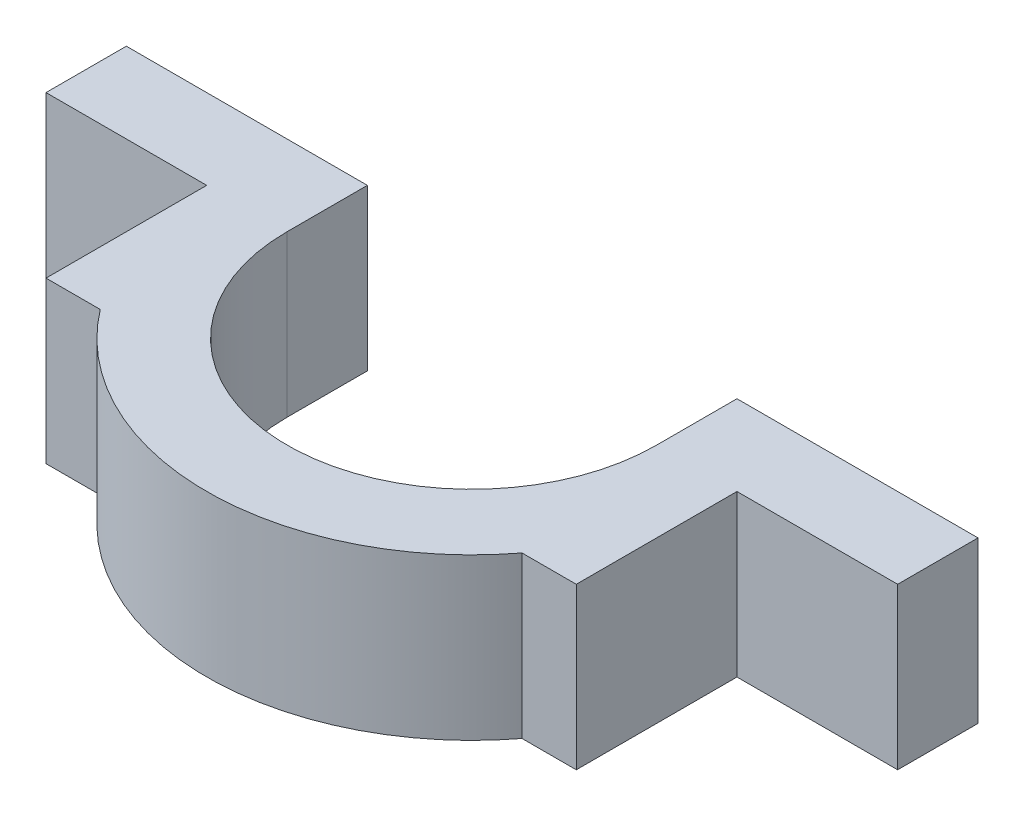
ISO-10303-21;
HEADER;
FILE_DESCRIPTION(('STEP AP214'),'2;1');
FILE_NAME('part.step','',(''),(''),'','','');
FILE_SCHEMA(('AUTOMOTIVE_DESIGN { 1 0 10303 214 1 1 1 1 }'));
ENDSEC;
DATA;
#1=APPLICATION_CONTEXT('core data for automotive mechanical design processes');
#2=APPLICATION_PROTOCOL_DEFINITION('international standard','automotive_design',2000,#1);
#3=PRODUCT_CONTEXT('',#1,'mechanical');
#4=PRODUCT('Part','Part','',(#3));
#5=PRODUCT_RELATED_PRODUCT_CATEGORY('part','',(#4));
#6=PRODUCT_DEFINITION_FORMATION('','',#4);
#7=PRODUCT_DEFINITION_CONTEXT('part definition',#1,'design');
#8=PRODUCT_DEFINITION('design','',#6,#7);
#9=PRODUCT_DEFINITION_SHAPE('','',#8);
#10=(LENGTH_UNIT() NAMED_UNIT(*) SI_UNIT(.MILLI.,.METRE.));
#11=(NAMED_UNIT(*) PLANE_ANGLE_UNIT() SI_UNIT($,.RADIAN.));
#12=(NAMED_UNIT(*) SI_UNIT($,.STERADIAN.) SOLID_ANGLE_UNIT());
#13=UNCERTAINTY_MEASURE_WITH_UNIT(LENGTH_MEASURE(1.E-05),#10,'distance_accuracy_value','');
#14=(GEOMETRIC_REPRESENTATION_CONTEXT(3) GLOBAL_UNCERTAINTY_ASSIGNED_CONTEXT((#13)) GLOBAL_UNIT_ASSIGNED_CONTEXT((#10,
#11,#12)) REPRESENTATION_CONTEXT('',''));
#15=CARTESIAN_POINT('',(0.,0.,0.));
#16=DIRECTION('',(0.,0.,1.));
#17=DIRECTION('',(1.,0.,0.));
#18=AXIS2_PLACEMENT_3D('',#15,#16,#17);
#19=CARTESIAN_POINT('',(0.,10.,0.));
#20=DIRECTION('',(0.,-1.,0.));
#21=DIRECTION('',(0.,0.,-1.));
#22=AXIS2_PLACEMENT_3D('',#19,#20,#21);
#23=CYLINDRICAL_SURFACE('',#22,16.5);
#24=CARTESIAN_POINT('',(0.,0.,0.));
#25=DIRECTION('',(0.,1.,0.));
#26=DIRECTION('',(0.,0.,1.));
#27=AXIS2_PLACEMENT_3D('',#24,#25,#26);
#28=CIRCLE('',#27,16.5);
#29=CARTESIAN_POINT('',(-13.1244047484067,0.,10.));
#30=VERTEX_POINT('',#29);
#31=CARTESIAN_POINT('',(13.1244047484067,0.,10.));
#32=VERTEX_POINT('',#31);
#33=EDGE_CURVE('E180',#30,#32,#28,.T.);
#34=ORIENTED_EDGE('',*,*,#33,.T.);
#35=DIRECTION('',(0.,-1.,0.));
#36=VECTOR('',#35,1.);
#37=CARTESIAN_POINT('',(13.1244047484067,10.,10.));
#38=LINE('',#37,#36);
#39=CARTESIAN_POINT('',(13.1244047484067,10.,10.));
#40=VERTEX_POINT('',#39);
#41=EDGE_CURVE('E11',#40,#32,#38,.T.);
#42=ORIENTED_EDGE('',*,*,#41,.F.);
#43=CARTESIAN_POINT('',(0.,10.,0.));
#44=DIRECTION('',(0.,1.,0.));
#45=DIRECTION('',(0.,0.,1.));
#46=AXIS2_PLACEMENT_3D('',#43,#44,#45);
#47=CIRCLE('',#46,16.5);
#48=CARTESIAN_POINT('',(-13.1244047484067,10.,10.));
#49=VERTEX_POINT('',#48);
#50=EDGE_CURVE('E220',#49,#40,#47,.T.);
#51=ORIENTED_EDGE('',*,*,#50,.F.);
#52=DIRECTION('',(0.,-1.,0.));
#53=VECTOR('',#52,1.);
#54=CARTESIAN_POINT('',(-13.1244047484067,10.,10.));
#55=LINE('',#54,#53);
#56=EDGE_CURVE('E176',#49,#30,#55,.T.);
#57=ORIENTED_EDGE('',*,*,#56,.T.);
#58=EDGE_LOOP('',(#34,#42,#51,#57));
#59=FACE_BOUND('',#58,.T.);
#60=ADVANCED_FACE('F43',(#59),#23,.T.);
#61=CARTESIAN_POINT('',(13.1244047484067,10.,10.));
#62=DIRECTION('',(0.,0.,-1.));
#63=DIRECTION('',(-1.,0.,0.));
#64=AXIS2_PLACEMENT_3D('',#61,#62,#63);
#65=PLANE('',#64);
#66=DIRECTION('',(1.,0.,0.));
#67=VECTOR('',#66,1.);
#68=CARTESIAN_POINT('',(13.1244047484067,0.,10.));
#69=LINE('',#68,#67);
#70=CARTESIAN_POINT('',(16.5,0.,10.));
#71=VERTEX_POINT('',#70);
#72=EDGE_CURVE('E184',#32,#71,#69,.T.);
#73=ORIENTED_EDGE('',*,*,#72,.T.);
#74=DIRECTION('',(0.,-1.,0.));
#75=VECTOR('',#74,1.);
#76=CARTESIAN_POINT('',(16.5,10.,10.));
#77=LINE('',#76,#75);
#78=CARTESIAN_POINT('',(16.5,10.,10.));
#79=VERTEX_POINT('',#78);
#80=EDGE_CURVE('E52',#79,#71,#77,.T.);
#81=ORIENTED_EDGE('',*,*,#80,.F.);
#82=DIRECTION('',(1.,0.,0.));
#83=VECTOR('',#82,1.);
#84=CARTESIAN_POINT('',(13.1244047484067,10.,10.));
#85=LINE('',#84,#83);
#86=EDGE_CURVE('E121',#40,#79,#85,.T.);
#87=ORIENTED_EDGE('',*,*,#86,.F.);
#88=ORIENTED_EDGE('',*,*,#41,.T.);
#89=EDGE_LOOP('',(#73,#81,#87,#88));
#90=FACE_BOUND('',#89,.T.);
#91=ADVANCED_FACE('F328',(#90),#65,.F.);
#92=CARTESIAN_POINT('',(16.5,10.,10.));
#93=DIRECTION('',(-1.,0.,0.));
#94=DIRECTION('',(0.,0.,1.));
#95=AXIS2_PLACEMENT_3D('',#92,#93,#94);
#96=PLANE('',#95);
#97=DIRECTION('',(0.,0.,-1.));
#98=VECTOR('',#97,1.);
#99=CARTESIAN_POINT('',(16.5,0.,10.));
#100=LINE('',#99,#98);
#101=CARTESIAN_POINT('',(16.5,0.,0.));
#102=VERTEX_POINT('',#101);
#103=EDGE_CURVE('E187',#71,#102,#100,.T.);
#104=ORIENTED_EDGE('',*,*,#103,.T.);
#105=DIRECTION('',(0.,-1.,0.));
#106=VECTOR('',#105,1.);
#107=CARTESIAN_POINT('',(16.5,10.,0.));
#108=LINE('',#107,#106);
#109=CARTESIAN_POINT('',(16.5,10.,0.));
#110=VERTEX_POINT('',#109);
#111=EDGE_CURVE('E255',#110,#102,#108,.T.);
#112=ORIENTED_EDGE('',*,*,#111,.F.);
#113=DIRECTION('',(0.,0.,-1.));
#114=VECTOR('',#113,1.);
#115=CARTESIAN_POINT('',(16.5,10.,10.));
#116=LINE('',#115,#114);
#117=EDGE_CURVE('E265',#79,#110,#116,.T.);
#118=ORIENTED_EDGE('',*,*,#117,.F.);
#119=ORIENTED_EDGE('',*,*,#80,.T.);
#120=EDGE_LOOP('',(#104,#112,#118,#119));
#121=FACE_BOUND('',#120,.T.);
#122=ADVANCED_FACE('F263',(#121),#96,.F.);
#123=CARTESIAN_POINT('',(16.5,10.,0.));
#124=DIRECTION('',(0.,0.,-1.));
#125=DIRECTION('',(-1.,0.,0.));
#126=AXIS2_PLACEMENT_3D('',#123,#124,#125);
#127=PLANE('',#126);
#128=DIRECTION('',(1.,0.,0.));
#129=VECTOR('',#128,1.);
#130=CARTESIAN_POINT('',(16.5,0.,0.));
#131=LINE('',#130,#129);
#132=CARTESIAN_POINT('',(26.5,0.,0.));
#133=VERTEX_POINT('',#132);
#134=EDGE_CURVE('E190',#102,#133,#131,.T.);
#135=ORIENTED_EDGE('',*,*,#134,.T.);
#136=DIRECTION('',(0.,-1.,0.));
#137=VECTOR('',#136,1.);
#138=CARTESIAN_POINT('',(26.5,10.,0.));
#139=LINE('',#138,#137);
#140=CARTESIAN_POINT('',(26.5,10.,0.));
#141=VERTEX_POINT('',#140);
#142=EDGE_CURVE('E251',#141,#133,#139,.T.);
#143=ORIENTED_EDGE('',*,*,#142,.F.);
#144=DIRECTION('',(1.,0.,0.));
#145=VECTOR('',#144,1.);
#146=CARTESIAN_POINT('',(16.5,10.,0.));
#147=LINE('',#146,#145);
#148=EDGE_CURVE('E284',#110,#141,#147,.T.);
#149=ORIENTED_EDGE('',*,*,#148,.F.);
#150=ORIENTED_EDGE('',*,*,#111,.T.);
#151=EDGE_LOOP('',(#135,#143,#149,#150));
#152=FACE_BOUND('',#151,.T.);
#153=ADVANCED_FACE('F274',(#152),#127,.F.);
#154=CARTESIAN_POINT('',(26.5,10.,0.));
#155=DIRECTION('',(-1.,0.,0.));
#156=DIRECTION('',(0.,0.,1.));
#157=AXIS2_PLACEMENT_3D('',#154,#155,#156);
#158=PLANE('',#157);
#159=DIRECTION('',(0.,0.,-1.));
#160=VECTOR('',#159,1.);
#161=CARTESIAN_POINT('',(26.5,0.,0.));
#162=LINE('',#161,#160);
#163=CARTESIAN_POINT('',(26.5,0.,-5.));
#164=VERTEX_POINT('',#163);
#165=EDGE_CURVE('E193',#133,#164,#162,.T.);
#166=ORIENTED_EDGE('',*,*,#165,.T.);
#167=DIRECTION('',(0.,-1.,0.));
#168=VECTOR('',#167,1.);
#169=CARTESIAN_POINT('',(26.5,10.,-5.));
#170=LINE('',#169,#168);
#171=CARTESIAN_POINT('',(26.5,10.,-5.));
#172=VERTEX_POINT('',#171);
#173=EDGE_CURVE('E247',#172,#164,#170,.T.);
#174=ORIENTED_EDGE('',*,*,#173,.F.);
#175=DIRECTION('',(0.,0.,-1.));
#176=VECTOR('',#175,1.);
#177=CARTESIAN_POINT('',(26.5,10.,0.));
#178=LINE('',#177,#176);
#179=EDGE_CURVE('E280',#141,#172,#178,.T.);
#180=ORIENTED_EDGE('',*,*,#179,.F.);
#181=ORIENTED_EDGE('',*,*,#142,.T.);
#182=EDGE_LOOP('',(#166,#174,#180,#181));
#183=FACE_BOUND('',#182,.T.);
#184=ADVANCED_FACE('F278',(#183),#158,.F.);
#185=CARTESIAN_POINT('',(26.5,10.,-5.));
#186=DIRECTION('',(0.,0.,1.));
#187=DIRECTION('',(1.,0.,0.));
#188=AXIS2_PLACEMENT_3D('',#185,#186,#187);
#189=PLANE('',#188);
#190=DIRECTION('',(-1.,0.,0.));
#191=VECTOR('',#190,1.);
#192=CARTESIAN_POINT('',(26.5,0.,-5.));
#193=LINE('',#192,#191);
#194=CARTESIAN_POINT('',(11.5,0.,-5.));
#195=VERTEX_POINT('',#194);
#196=EDGE_CURVE('E196',#164,#195,#193,.T.);
#197=ORIENTED_EDGE('',*,*,#196,.T.);
#198=DIRECTION('',(0.,-1.,0.));
#199=VECTOR('',#198,1.);
#200=CARTESIAN_POINT('',(11.5,10.,-5.));
#201=LINE('',#200,#199);
#202=CARTESIAN_POINT('',(11.5,10.,-5.));
#203=VERTEX_POINT('',#202);
#204=EDGE_CURVE('E243',#203,#195,#201,.T.);
#205=ORIENTED_EDGE('',*,*,#204,.F.);
#206=DIRECTION('',(-1.,0.,0.));
#207=VECTOR('',#206,1.);
#208=CARTESIAN_POINT('',(26.5,10.,-5.));
#209=LINE('',#208,#207);
#210=EDGE_CURVE('E283',#172,#203,#209,.T.);
#211=ORIENTED_EDGE('',*,*,#210,.F.);
#212=ORIENTED_EDGE('',*,*,#173,.T.);
#213=EDGE_LOOP('',(#197,#205,#211,#212));
#214=FACE_BOUND('',#213,.T.);
#215=ADVANCED_FACE('F341',(#214),#189,.F.);
#216=CARTESIAN_POINT('',(11.5,10.,0.));
#217=DIRECTION('',(1.,0.,0.));
#218=DIRECTION('',(0.,0.,-1.));
#219=AXIS2_PLACEMENT_3D('',#216,#217,#218);
#220=PLANE('',#219);
#221=DIRECTION('',(0.,0.,1.));
#222=VECTOR('',#221,1.);
#223=CARTESIAN_POINT('',(11.5,0.,0.));
#224=LINE('',#223,#222);
#225=CARTESIAN_POINT('',(11.5,0.,0.));
#226=VERTEX_POINT('',#225);
#227=EDGE_CURVE('E199',#195,#226,#224,.T.);
#228=ORIENTED_EDGE('',*,*,#227,.T.);
#229=DIRECTION('',(0.,-1.,0.));
#230=VECTOR('',#229,1.);
#231=CARTESIAN_POINT('',(11.5,10.,0.));
#232=LINE('',#231,#230);
#233=CARTESIAN_POINT('',(11.5,10.,0.));
#234=VERTEX_POINT('',#233);
#235=EDGE_CURVE('E239',#234,#226,#232,.T.);
#236=ORIENTED_EDGE('',*,*,#235,.F.);
#237=DIRECTION('',(0.,0.,1.));
#238=VECTOR('',#237,1.);
#239=CARTESIAN_POINT('',(11.5,10.,0.));
#240=LINE('',#239,#238);
#241=EDGE_CURVE('E288',#203,#234,#240,.T.);
#242=ORIENTED_EDGE('',*,*,#241,.F.);
#243=ORIENTED_EDGE('',*,*,#204,.T.);
#244=EDGE_LOOP('',(#228,#236,#242,#243));
#245=FACE_BOUND('',#244,.T.);
#246=ADVANCED_FACE('F344',(#245),#220,.F.);
#247=CARTESIAN_POINT('',(0.,10.,0.));
#248=DIRECTION('',(0.,-1.,0.));
#249=DIRECTION('',(0.,0.,-1.));
#250=AXIS2_PLACEMENT_3D('',#247,#248,#249);
#251=CYLINDRICAL_SURFACE('',#250,11.5);
#252=CARTESIAN_POINT('',(0.,0.,0.));
#253=DIRECTION('',(0.,-1.,0.));
#254=DIRECTION('',(0.,0.,1.));
#255=AXIS2_PLACEMENT_3D('',#252,#253,#254);
#256=CIRCLE('',#255,11.5);
#257=CARTESIAN_POINT('',(-11.5,0.,0.));
#258=VERTEX_POINT('',#257);
#259=EDGE_CURVE('E202',#226,#258,#256,.T.);
#260=ORIENTED_EDGE('',*,*,#259,.T.);
#261=DIRECTION('',(0.,-1.,0.));
#262=VECTOR('',#261,1.);
#263=CARTESIAN_POINT('',(-11.5,10.,0.));
#264=LINE('',#263,#262);
#265=CARTESIAN_POINT('',(-11.5,10.,0.));
#266=VERTEX_POINT('',#265);
#267=EDGE_CURVE('E235',#266,#258,#264,.T.);
#268=ORIENTED_EDGE('',*,*,#267,.F.);
#269=CARTESIAN_POINT('',(0.,10.,0.));
#270=DIRECTION('',(0.,-1.,0.));
#271=DIRECTION('',(0.,0.,1.));
#272=AXIS2_PLACEMENT_3D('',#269,#270,#271);
#273=CIRCLE('',#272,11.5);
#274=EDGE_CURVE('E295',#234,#266,#273,.T.);
#275=ORIENTED_EDGE('',*,*,#274,.F.);
#276=ORIENTED_EDGE('',*,*,#235,.T.);
#277=EDGE_LOOP('',(#260,#268,#275,#276));
#278=FACE_BOUND('',#277,.T.);
#279=ADVANCED_FACE('F348',(#278),#251,.F.);
#280=CARTESIAN_POINT('',(-11.5,10.,0.));
#281=DIRECTION('',(-1.,0.,0.));
#282=DIRECTION('',(0.,0.,1.));
#283=AXIS2_PLACEMENT_3D('',#280,#281,#282);
#284=PLANE('',#283);
#285=DIRECTION('',(0.,0.,-1.));
#286=VECTOR('',#285,1.);
#287=CARTESIAN_POINT('',(-11.5,0.,0.));
#288=LINE('',#287,#286);
#289=CARTESIAN_POINT('',(-11.5,0.,-5.));
#290=VERTEX_POINT('',#289);
#291=EDGE_CURVE('E205',#258,#290,#288,.T.);
#292=ORIENTED_EDGE('',*,*,#291,.T.);
#293=DIRECTION('',(0.,-1.,0.));
#294=VECTOR('',#293,1.);
#295=CARTESIAN_POINT('',(-11.5,10.,-5.));
#296=LINE('',#295,#294);
#297=CARTESIAN_POINT('',(-11.5,10.,-5.));
#298=VERTEX_POINT('',#297);
#299=EDGE_CURVE('E231',#298,#290,#296,.T.);
#300=ORIENTED_EDGE('',*,*,#299,.F.);
#301=DIRECTION('',(0.,0.,-1.));
#302=VECTOR('',#301,1.);
#303=CARTESIAN_POINT('',(-11.5,10.,0.));
#304=LINE('',#303,#302);
#305=EDGE_CURVE('E298',#266,#298,#304,.T.);
#306=ORIENTED_EDGE('',*,*,#305,.F.);
#307=ORIENTED_EDGE('',*,*,#267,.T.);
#308=EDGE_LOOP('',(#292,#300,#306,#307));
#309=FACE_BOUND('',#308,.T.);
#310=ADVANCED_FACE('F352',(#309),#284,.F.);
#311=CARTESIAN_POINT('',(-11.5,10.,-5.));
#312=DIRECTION('',(0.,0.,1.));
#313=DIRECTION('',(1.,0.,0.));
#314=AXIS2_PLACEMENT_3D('',#311,#312,#313);
#315=PLANE('',#314);
#316=DIRECTION('',(-1.,0.,0.));
#317=VECTOR('',#316,1.);
#318=CARTESIAN_POINT('',(-11.5,0.,-5.));
#319=LINE('',#318,#317);
#320=CARTESIAN_POINT('',(-26.5,0.,-4.99999999999999));
#321=VERTEX_POINT('',#320);
#322=EDGE_CURVE('E208',#290,#321,#319,.T.);
#323=ORIENTED_EDGE('',*,*,#322,.T.);
#324=DIRECTION('',(0.,-1.,0.));
#325=VECTOR('',#324,1.);
#326=CARTESIAN_POINT('',(-26.5,10.,-4.99999999999999));
#327=LINE('',#326,#325);
#328=CARTESIAN_POINT('',(-26.5,10.,-4.99999999999999));
#329=VERTEX_POINT('',#328);
#330=EDGE_CURVE('E227',#329,#321,#327,.T.);
#331=ORIENTED_EDGE('',*,*,#330,.F.);
#332=DIRECTION('',(-1.,0.,0.));
#333=VECTOR('',#332,1.);
#334=CARTESIAN_POINT('',(-11.5,10.,-5.));
#335=LINE('',#334,#333);
#336=EDGE_CURVE('E301',#298,#329,#335,.T.);
#337=ORIENTED_EDGE('',*,*,#336,.F.);
#338=ORIENTED_EDGE('',*,*,#299,.T.);
#339=EDGE_LOOP('',(#323,#331,#337,#338));
#340=FACE_BOUND('',#339,.T.);
#341=ADVANCED_FACE('F309',(#340),#315,.F.);
#342=CARTESIAN_POINT('',(-26.5,10.,-4.99999999999999));
#343=DIRECTION('',(1.,0.,0.));
#344=DIRECTION('',(0.,0.,-1.));
#345=AXIS2_PLACEMENT_3D('',#342,#343,#344);
#346=PLANE('',#345);
#347=DIRECTION('',(0.,0.,1.));
#348=VECTOR('',#347,1.);
#349=CARTESIAN_POINT('',(-26.5,0.,-4.99999999999999));
#350=LINE('',#349,#348);
#351=CARTESIAN_POINT('',(-26.5,0.,0.));
#352=VERTEX_POINT('',#351);
#353=EDGE_CURVE('E211',#321,#352,#350,.T.);
#354=ORIENTED_EDGE('',*,*,#353,.T.);
#355=DIRECTION('',(0.,-1.,0.));
#356=VECTOR('',#355,1.);
#357=CARTESIAN_POINT('',(-26.5,10.,0.));
#358=LINE('',#357,#356);
#359=CARTESIAN_POINT('',(-26.5,10.,0.));
#360=VERTEX_POINT('',#359);
#361=EDGE_CURVE('E169',#360,#352,#358,.T.);
#362=ORIENTED_EDGE('',*,*,#361,.F.);
#363=DIRECTION('',(0.,0.,1.));
#364=VECTOR('',#363,1.);
#365=CARTESIAN_POINT('',(-26.5,10.,-4.99999999999999));
#366=LINE('',#365,#364);
#367=EDGE_CURVE('E158',#329,#360,#366,.T.);
#368=ORIENTED_EDGE('',*,*,#367,.F.);
#369=ORIENTED_EDGE('',*,*,#330,.T.);
#370=EDGE_LOOP('',(#354,#362,#368,#369));
#371=FACE_BOUND('',#370,.T.);
#372=ADVANCED_FACE('F313',(#371),#346,.F.);
#373=CARTESIAN_POINT('',(-26.5,10.,0.));
#374=DIRECTION('',(0.,0.,-1.));
#375=DIRECTION('',(-1.,0.,0.));
#376=AXIS2_PLACEMENT_3D('',#373,#374,#375);
#377=PLANE('',#376);
#378=DIRECTION('',(1.,0.,0.));
#379=VECTOR('',#378,1.);
#380=CARTESIAN_POINT('',(-26.5,0.,0.));
#381=LINE('',#380,#379);
#382=CARTESIAN_POINT('',(-16.5,0.,0.));
#383=VERTEX_POINT('',#382);
#384=EDGE_CURVE('E167',#352,#383,#381,.T.);
#385=ORIENTED_EDGE('',*,*,#384,.T.);
#386=DIRECTION('',(0.,-1.,0.));
#387=VECTOR('',#386,1.);
#388=CARTESIAN_POINT('',(-16.5,10.,0.));
#389=LINE('',#388,#387);
#390=CARTESIAN_POINT('',(-16.5,10.,0.));
#391=VERTEX_POINT('',#390);
#392=EDGE_CURVE('E164',#391,#383,#389,.T.);
#393=ORIENTED_EDGE('',*,*,#392,.F.);
#394=DIRECTION('',(1.,0.,0.));
#395=VECTOR('',#394,1.);
#396=CARTESIAN_POINT('',(-26.5,10.,0.));
#397=LINE('',#396,#395);
#398=EDGE_CURVE('E152',#360,#391,#397,.T.);
#399=ORIENTED_EDGE('',*,*,#398,.F.);
#400=ORIENTED_EDGE('',*,*,#361,.T.);
#401=EDGE_LOOP('',(#385,#393,#399,#400));
#402=FACE_BOUND('',#401,.T.);
#403=ADVANCED_FACE('F165',(#402),#377,.F.);
#404=CARTESIAN_POINT('',(-16.5,10.,0.));
#405=DIRECTION('',(1.,0.,0.));
#406=DIRECTION('',(0.,0.,-1.));
#407=AXIS2_PLACEMENT_3D('',#404,#405,#406);
#408=PLANE('',#407);
#409=DIRECTION('',(0.,0.,1.));
#410=VECTOR('',#409,1.);
#411=CARTESIAN_POINT('',(-16.5,0.,0.));
#412=LINE('',#411,#410);
#413=CARTESIAN_POINT('',(-16.5,0.,10.));
#414=VERTEX_POINT('',#413);
#415=EDGE_CURVE('E107',#383,#414,#412,.T.);
#416=ORIENTED_EDGE('',*,*,#415,.T.);
#417=DIRECTION('',(0.,-1.,0.));
#418=VECTOR('',#417,1.);
#419=CARTESIAN_POINT('',(-16.5,10.,10.));
#420=LINE('',#419,#418);
#421=CARTESIAN_POINT('',(-16.5,10.,10.));
#422=VERTEX_POINT('',#421);
#423=EDGE_CURVE('E170',#422,#414,#420,.T.);
#424=ORIENTED_EDGE('',*,*,#423,.F.);
#425=DIRECTION('',(0.,0.,1.));
#426=VECTOR('',#425,1.);
#427=CARTESIAN_POINT('',(-16.5,10.,0.));
#428=LINE('',#427,#426);
#429=EDGE_CURVE('E156',#391,#422,#428,.T.);
#430=ORIENTED_EDGE('',*,*,#429,.F.);
#431=ORIENTED_EDGE('',*,*,#392,.T.);
#432=EDGE_LOOP('',(#416,#424,#430,#431));
#433=FACE_BOUND('',#432,.T.);
#434=ADVANCED_FACE('F172',(#433),#408,.F.);
#435=CARTESIAN_POINT('',(-16.5,10.,10.));
#436=DIRECTION('',(0.,0.,-1.));
#437=DIRECTION('',(-1.,0.,0.));
#438=AXIS2_PLACEMENT_3D('',#435,#436,#437);
#439=PLANE('',#438);
#440=DIRECTION('',(1.,0.,0.));
#441=VECTOR('',#440,1.);
#442=CARTESIAN_POINT('',(-16.5,0.,10.));
#443=LINE('',#442,#441);
#444=EDGE_CURVE('E113',#414,#30,#443,.T.);
#445=ORIENTED_EDGE('',*,*,#444,.T.);
#446=ORIENTED_EDGE('',*,*,#56,.F.);
#447=DIRECTION('',(1.,0.,0.));
#448=VECTOR('',#447,1.);
#449=CARTESIAN_POINT('',(-16.5,10.,10.));
#450=LINE('',#449,#448);
#451=EDGE_CURVE('E60',#422,#49,#450,.T.);
#452=ORIENTED_EDGE('',*,*,#451,.F.);
#453=ORIENTED_EDGE('',*,*,#423,.T.);
#454=EDGE_LOOP('',(#445,#446,#452,#453));
#455=FACE_BOUND('',#454,.T.);
#456=ADVANCED_FACE('F317',(#455),#439,.F.);
#457=CARTESIAN_POINT('',(0.,10.,0.));
#458=DIRECTION('',(0.,1.,0.));
#459=DIRECTION('',(0.,0.,1.));
#460=AXIS2_PLACEMENT_3D('',#457,#458,#459);
#461=PLANE('',#460);
#462=ORIENTED_EDGE('',*,*,#50,.T.);
#463=ORIENTED_EDGE('',*,*,#86,.T.);
#464=ORIENTED_EDGE('',*,*,#117,.T.);
#465=ORIENTED_EDGE('',*,*,#148,.T.);
#466=ORIENTED_EDGE('',*,*,#179,.T.);
#467=ORIENTED_EDGE('',*,*,#210,.T.);
#468=ORIENTED_EDGE('',*,*,#241,.T.);
#469=ORIENTED_EDGE('',*,*,#274,.T.);
#470=ORIENTED_EDGE('',*,*,#305,.T.);
#471=ORIENTED_EDGE('',*,*,#336,.T.);
#472=ORIENTED_EDGE('',*,*,#367,.T.);
#473=ORIENTED_EDGE('',*,*,#398,.T.);
#474=ORIENTED_EDGE('',*,*,#429,.T.);
#475=ORIENTED_EDGE('',*,*,#451,.T.);
#476=EDGE_LOOP('',(#462,#463,#464,#465,#466,#467,#468,#469,#470,#471,#472,#473,#474,#475));
#477=FACE_BOUND('',#476,.T.);
#478=ADVANCED_FACE('F154',(#477),#461,.T.);
#479=CARTESIAN_POINT('',(0.,0.,0.));
#480=DIRECTION('',(0.,1.,0.));
#481=DIRECTION('',(0.,0.,1.));
#482=AXIS2_PLACEMENT_3D('',#479,#480,#481);
#483=PLANE('',#482);
#484=ORIENTED_EDGE('',*,*,#33,.F.);
#485=ORIENTED_EDGE('',*,*,#444,.F.);
#486=ORIENTED_EDGE('',*,*,#415,.F.);
#487=ORIENTED_EDGE('',*,*,#384,.F.);
#488=ORIENTED_EDGE('',*,*,#353,.F.);
#489=ORIENTED_EDGE('',*,*,#322,.F.);
#490=ORIENTED_EDGE('',*,*,#291,.F.);
#491=ORIENTED_EDGE('',*,*,#259,.F.);
#492=ORIENTED_EDGE('',*,*,#227,.F.);
#493=ORIENTED_EDGE('',*,*,#196,.F.);
#494=ORIENTED_EDGE('',*,*,#165,.F.);
#495=ORIENTED_EDGE('',*,*,#134,.F.);
#496=ORIENTED_EDGE('',*,*,#103,.F.);
#497=ORIENTED_EDGE('',*,*,#72,.F.);
#498=EDGE_LOOP('',(#484,#485,#486,#487,#488,#489,#490,#491,#492,#493,#494,#495,#496,#497));
#499=FACE_BOUND('',#498,.T.);
#500=ADVANCED_FACE('F269',(#499),#483,.F.);
#501=CLOSED_SHELL('',(#60,#91,#122,#153,#184,#215,#246,#279,#310,#341,#372,#403,#434,#456,#478,#500));
#502=MANIFOLD_SOLID_BREP('B2',#501);
#503=ADVANCED_BREP_SHAPE_REPRESENTATION('',(#18,#502),#14);
#504=SHAPE_DEFINITION_REPRESENTATION(#9,#503);
ENDSEC;
END-ISO-10303-21;
